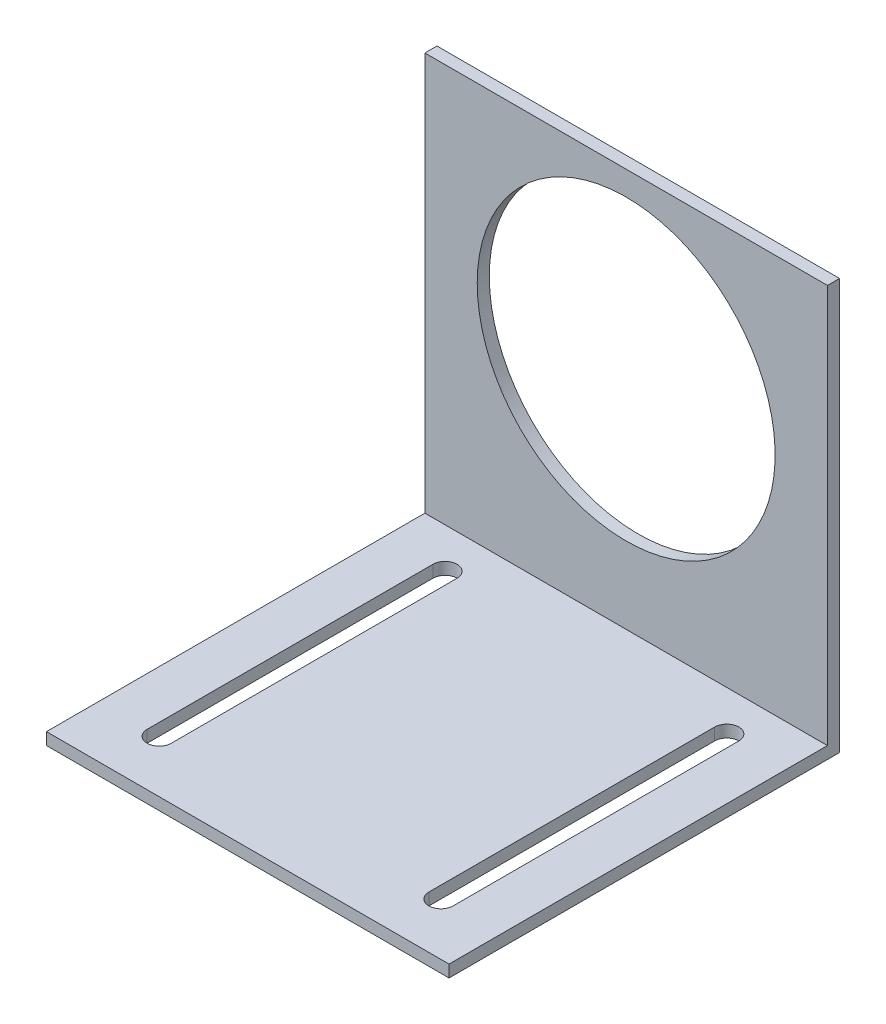
ISO-10303-21;
HEADER;
FILE_DESCRIPTION(('STEP AP214'),'2;1');
FILE_NAME('part.step','',(''),(''),'','','');
FILE_SCHEMA(('AUTOMOTIVE_DESIGN { 1 0 10303 214 1 1 1 1 }'));
ENDSEC;
DATA;
#1=APPLICATION_CONTEXT('core data for automotive mechanical design processes');
#2=APPLICATION_PROTOCOL_DEFINITION('international standard','automotive_design',2000,#1);
#3=PRODUCT_CONTEXT('',#1,'mechanical');
#4=PRODUCT('Part','Part','',(#3));
#5=PRODUCT_RELATED_PRODUCT_CATEGORY('part','',(#4));
#6=PRODUCT_DEFINITION_FORMATION('','',#4);
#7=PRODUCT_DEFINITION_CONTEXT('part definition',#1,'design');
#8=PRODUCT_DEFINITION('design','',#6,#7);
#9=PRODUCT_DEFINITION_SHAPE('','',#8);
#10=(LENGTH_UNIT() NAMED_UNIT(*) SI_UNIT(.MILLI.,.METRE.));
#11=(NAMED_UNIT(*) PLANE_ANGLE_UNIT() SI_UNIT($,.RADIAN.));
#12=(NAMED_UNIT(*) SI_UNIT($,.STERADIAN.) SOLID_ANGLE_UNIT());
#13=UNCERTAINTY_MEASURE_WITH_UNIT(LENGTH_MEASURE(1.E-05),#10,'distance_accuracy_value','');
#14=(GEOMETRIC_REPRESENTATION_CONTEXT(3) GLOBAL_UNCERTAINTY_ASSIGNED_CONTEXT((#13)) GLOBAL_UNIT_ASSIGNED_CONTEXT((#10,
#11,#12)) REPRESENTATION_CONTEXT('',''));
#15=CARTESIAN_POINT('',(0.,0.,0.));
#16=DIRECTION('',(0.,0.,1.));
#17=DIRECTION('',(1.,0.,0.));
#18=AXIS2_PLACEMENT_3D('',#15,#16,#17);
#19=CARTESIAN_POINT('',(0.,3.,0.));
#20=DIRECTION('',(0.,-1.,0.));
#21=DIRECTION('',(0.,0.,-1.));
#22=AXIS2_PLACEMENT_3D('',#19,#20,#21);
#23=PLANE('',#22);
#24=CARTESIAN_POINT('',(85.,3.,-13.));
#25=DIRECTION('',(0.,1.,0.));
#26=DIRECTION('',(0.,0.,1.));
#27=AXIS2_PLACEMENT_3D('',#24,#25,#26);
#28=CIRCLE('',#27,3.00000000000002);
#29=CARTESIAN_POINT('',(82.,3.,-13.));
#30=VERTEX_POINT('',#29);
#31=CARTESIAN_POINT('',(88.,3.,-13.));
#32=VERTEX_POINT('',#31);
#33=EDGE_CURVE('E165',#30,#32,#28,.T.);
#34=ORIENTED_EDGE('',*,*,#33,.F.);
#35=DIRECTION('',(0.,0.,1.));
#36=VECTOR('',#35,1.);
#37=CARTESIAN_POINT('',(82.,3.,-13.));
#38=LINE('',#37,#36);
#39=CARTESIAN_POINT('',(82.,3.,-84.));
#40=VERTEX_POINT('',#39);
#41=EDGE_CURVE('E173',#40,#30,#38,.T.);
#42=ORIENTED_EDGE('',*,*,#41,.F.);
#43=CARTESIAN_POINT('',(85.,3.,-84.));
#44=DIRECTION('',(0.,1.,0.));
#45=DIRECTION('',(0.,0.,1.));
#46=AXIS2_PLACEMENT_3D('',#43,#44,#45);
#47=CIRCLE('',#46,3.00000000000002);
#48=CARTESIAN_POINT('',(88.,3.,-84.));
#49=VERTEX_POINT('',#48);
#50=EDGE_CURVE('E170',#49,#40,#47,.T.);
#51=ORIENTED_EDGE('',*,*,#50,.F.);
#52=DIRECTION('',(0.,0.,-1.));
#53=VECTOR('',#52,1.);
#54=CARTESIAN_POINT('',(88.,3.,-13.));
#55=LINE('',#54,#53);
#56=EDGE_CURVE('E167',#32,#49,#55,.T.);
#57=ORIENTED_EDGE('',*,*,#56,.F.);
#58=EDGE_LOOP('',(#34,#42,#51,#57));
#59=FACE_BOUND('',#58,.T.);
#60=CARTESIAN_POINT('',(15.,3.,-84.));
#61=DIRECTION('',(0.,1.,0.));
#62=DIRECTION('',(0.,0.,1.));
#63=AXIS2_PLACEMENT_3D('',#60,#61,#62);
#64=CIRCLE('',#63,3.);
#65=CARTESIAN_POINT('',(18.,3.,-84.));
#66=VERTEX_POINT('',#65);
#67=CARTESIAN_POINT('',(12.,3.,-84.));
#68=VERTEX_POINT('',#67);
#69=EDGE_CURVE('E196',#66,#68,#64,.T.);
#70=ORIENTED_EDGE('',*,*,#69,.F.);
#71=DIRECTION('',(0.,0.,-1.));
#72=VECTOR('',#71,1.);
#73=CARTESIAN_POINT('',(18.,3.,-84.));
#74=LINE('',#73,#72);
#75=CARTESIAN_POINT('',(18.,3.,-13.));
#76=VERTEX_POINT('',#75);
#77=EDGE_CURVE('E204',#76,#66,#74,.T.);
#78=ORIENTED_EDGE('',*,*,#77,.F.);
#79=CARTESIAN_POINT('',(15.,3.,-13.));
#80=DIRECTION('',(0.,1.,0.));
#81=DIRECTION('',(0.,0.,1.));
#82=AXIS2_PLACEMENT_3D('',#79,#80,#81);
#83=CIRCLE('',#82,3.);
#84=CARTESIAN_POINT('',(12.,3.,-13.));
#85=VERTEX_POINT('',#84);
#86=EDGE_CURVE('E201',#85,#76,#83,.T.);
#87=ORIENTED_EDGE('',*,*,#86,.F.);
#88=DIRECTION('',(0.,0.,1.));
#89=VECTOR('',#88,1.);
#90=CARTESIAN_POINT('',(12.,3.,-84.));
#91=LINE('',#90,#89);
#92=EDGE_CURVE('E198',#68,#85,#91,.T.);
#93=ORIENTED_EDGE('',*,*,#92,.F.);
#94=EDGE_LOOP('',(#70,#78,#87,#93));
#95=FACE_BOUND('',#94,.T.);
#96=DIRECTION('',(1.,0.,0.));
#97=VECTOR('',#96,1.);
#98=CARTESIAN_POINT('',(0.,3.,-94.));
#99=LINE('',#98,#97);
#100=CARTESIAN_POINT('',(0.,3.,-94.));
#101=VERTEX_POINT('',#100);
#102=CARTESIAN_POINT('',(100.,3.,-94.));
#103=VERTEX_POINT('',#102);
#104=EDGE_CURVE('E49',#101,#103,#99,.T.);
#105=ORIENTED_EDGE('',*,*,#104,.F.);
#106=DIRECTION('',(0.,0.,1.));
#107=VECTOR('',#106,1.);
#108=CARTESIAN_POINT('',(0.,3.,0.));
#109=LINE('',#108,#107);
#110=CARTESIAN_POINT('',(0.,3.,0.));
#111=VERTEX_POINT('',#110);
#112=EDGE_CURVE('E139',#101,#111,#109,.T.);
#113=ORIENTED_EDGE('',*,*,#112,.T.);
#114=DIRECTION('',(1.,0.,0.));
#115=VECTOR('',#114,1.);
#116=CARTESIAN_POINT('',(0.,3.,0.));
#117=LINE('',#116,#115);
#118=CARTESIAN_POINT('',(100.,3.,0.));
#119=VERTEX_POINT('',#118);
#120=EDGE_CURVE('E228',#111,#119,#117,.T.);
#121=ORIENTED_EDGE('',*,*,#120,.T.);
#122=DIRECTION('',(0.,0.,-1.));
#123=VECTOR('',#122,1.);
#124=CARTESIAN_POINT('',(100.,3.,0.));
#125=LINE('',#124,#123);
#126=EDGE_CURVE('E54',#119,#103,#125,.T.);
#127=ORIENTED_EDGE('',*,*,#126,.T.);
#128=EDGE_LOOP('',(#105,#113,#121,#127));
#129=FACE_BOUND('',#128,.T.);
#130=ADVANCED_FACE('F34',(#59,#95,#129),#23,.F.);
#131=CARTESIAN_POINT('',(0.,0.,0.));
#132=DIRECTION('',(0.,-1.,0.));
#133=DIRECTION('',(0.,0.,-1.));
#134=AXIS2_PLACEMENT_3D('',#131,#132,#133);
#135=PLANE('',#134);
#136=DIRECTION('',(-1.,0.,0.));
#137=VECTOR('',#136,1.);
#138=CARTESIAN_POINT('',(0.,0.,-97.));
#139=LINE('',#138,#137);
#140=CARTESIAN_POINT('',(100.,0.,-97.));
#141=VERTEX_POINT('',#140);
#142=CARTESIAN_POINT('',(0.,0.,-97.));
#143=VERTEX_POINT('',#142);
#144=EDGE_CURVE('E229',#141,#143,#139,.T.);
#145=ORIENTED_EDGE('',*,*,#144,.F.);
#146=DIRECTION('',(0.,0.,-1.));
#147=VECTOR('',#146,1.);
#148=CARTESIAN_POINT('',(100.,0.,0.));
#149=LINE('',#148,#147);
#150=CARTESIAN_POINT('',(100.,0.,0.));
#151=VERTEX_POINT('',#150);
#152=EDGE_CURVE('E236',#151,#141,#149,.T.);
#153=ORIENTED_EDGE('',*,*,#152,.F.);
#154=DIRECTION('',(1.,0.,0.));
#155=VECTOR('',#154,1.);
#156=CARTESIAN_POINT('',(0.,0.,0.));
#157=LINE('',#156,#155);
#158=CARTESIAN_POINT('',(0.,0.,0.));
#159=VERTEX_POINT('',#158);
#160=EDGE_CURVE('E234',#159,#151,#157,.T.);
#161=ORIENTED_EDGE('',*,*,#160,.F.);
#162=DIRECTION('',(0.,0.,1.));
#163=VECTOR('',#162,1.);
#164=CARTESIAN_POINT('',(0.,0.,0.));
#165=LINE('',#164,#163);
#166=EDGE_CURVE('E226',#143,#159,#165,.T.);
#167=ORIENTED_EDGE('',*,*,#166,.F.);
#168=EDGE_LOOP('',(#145,#153,#161,#167));
#169=FACE_BOUND('',#168,.T.);
#170=DIRECTION('',(0.,0.,-1.));
#171=VECTOR('',#170,1.);
#172=CARTESIAN_POINT('',(18.,0.,-84.));
#173=LINE('',#172,#171);
#174=CARTESIAN_POINT('',(18.,0.,-13.));
#175=VERTEX_POINT('',#174);
#176=CARTESIAN_POINT('',(18.,0.,-84.));
#177=VERTEX_POINT('',#176);
#178=EDGE_CURVE('E199',#175,#177,#173,.T.);
#179=ORIENTED_EDGE('',*,*,#178,.T.);
#180=CARTESIAN_POINT('',(15.,0.,-84.));
#181=DIRECTION('',(0.,1.,0.));
#182=DIRECTION('',(0.,0.,1.));
#183=AXIS2_PLACEMENT_3D('',#180,#181,#182);
#184=CIRCLE('',#183,3.);
#185=CARTESIAN_POINT('',(12.,0.,-84.));
#186=VERTEX_POINT('',#185);
#187=EDGE_CURVE('E195',#177,#186,#184,.T.);
#188=ORIENTED_EDGE('',*,*,#187,.T.);
#189=DIRECTION('',(0.,0.,1.));
#190=VECTOR('',#189,1.);
#191=CARTESIAN_POINT('',(12.,0.,-84.));
#192=LINE('',#191,#190);
#193=CARTESIAN_POINT('',(12.,0.,-13.));
#194=VERTEX_POINT('',#193);
#195=EDGE_CURVE('E209',#186,#194,#192,.T.);
#196=ORIENTED_EDGE('',*,*,#195,.T.);
#197=CARTESIAN_POINT('',(15.,0.,-13.));
#198=DIRECTION('',(0.,1.,0.));
#199=DIRECTION('',(0.,0.,1.));
#200=AXIS2_PLACEMENT_3D('',#197,#198,#199);
#201=CIRCLE('',#200,3.);
#202=EDGE_CURVE('E212',#194,#175,#201,.T.);
#203=ORIENTED_EDGE('',*,*,#202,.T.);
#204=EDGE_LOOP('',(#179,#188,#196,#203));
#205=FACE_BOUND('',#204,.T.);
#206=DIRECTION('',(0.,0.,1.));
#207=VECTOR('',#206,1.);
#208=CARTESIAN_POINT('',(82.,0.,-13.));
#209=LINE('',#208,#207);
#210=CARTESIAN_POINT('',(82.,0.,-84.));
#211=VERTEX_POINT('',#210);
#212=CARTESIAN_POINT('',(82.,0.,-13.));
#213=VERTEX_POINT('',#212);
#214=EDGE_CURVE('E168',#211,#213,#209,.T.);
#215=ORIENTED_EDGE('',*,*,#214,.T.);
#216=CARTESIAN_POINT('',(85.,0.,-13.));
#217=DIRECTION('',(0.,1.,0.));
#218=DIRECTION('',(0.,0.,1.));
#219=AXIS2_PLACEMENT_3D('',#216,#217,#218);
#220=CIRCLE('',#219,3.00000000000002);
#221=CARTESIAN_POINT('',(88.,0.,-13.));
#222=VERTEX_POINT('',#221);
#223=EDGE_CURVE('E164',#213,#222,#220,.T.);
#224=ORIENTED_EDGE('',*,*,#223,.T.);
#225=DIRECTION('',(0.,0.,-1.));
#226=VECTOR('',#225,1.);
#227=CARTESIAN_POINT('',(88.,0.,-13.));
#228=LINE('',#227,#226);
#229=CARTESIAN_POINT('',(88.,0.,-84.));
#230=VERTEX_POINT('',#229);
#231=EDGE_CURVE('E178',#222,#230,#228,.T.);
#232=ORIENTED_EDGE('',*,*,#231,.T.);
#233=CARTESIAN_POINT('',(85.,0.,-84.));
#234=DIRECTION('',(0.,1.,0.));
#235=DIRECTION('',(0.,0.,1.));
#236=AXIS2_PLACEMENT_3D('',#233,#234,#235);
#237=CIRCLE('',#236,3.00000000000002);
#238=EDGE_CURVE('E181',#230,#211,#237,.T.);
#239=ORIENTED_EDGE('',*,*,#238,.T.);
#240=EDGE_LOOP('',(#215,#224,#232,#239));
#241=FACE_BOUND('',#240,.T.);
#242=ADVANCED_FACE('F252',(#169,#205,#241),#135,.T.);
#243=CARTESIAN_POINT('',(0.,3.,0.));
#244=DIRECTION('',(1.,0.,0.));
#245=DIRECTION('',(0.,0.,-1.));
#246=AXIS2_PLACEMENT_3D('',#243,#244,#245);
#247=PLANE('',#246);
#248=ORIENTED_EDGE('',*,*,#166,.T.);
#249=DIRECTION('',(0.,-1.,0.));
#250=VECTOR('',#249,1.);
#251=CARTESIAN_POINT('',(0.,3.,0.));
#252=LINE('',#251,#250);
#253=EDGE_CURVE('E11',#111,#159,#252,.T.);
#254=ORIENTED_EDGE('',*,*,#253,.F.);
#255=ORIENTED_EDGE('',*,*,#112,.F.);
#256=DIRECTION('',(0.,1.,0.));
#257=VECTOR('',#256,1.);
#258=CARTESIAN_POINT('',(0.,0.,-94.));
#259=LINE('',#258,#257);
#260=CARTESIAN_POINT('',(0.,102.,-94.));
#261=VERTEX_POINT('',#260);
#262=EDGE_CURVE('E133',#101,#261,#259,.T.);
#263=ORIENTED_EDGE('',*,*,#262,.T.);
#264=DIRECTION('',(0.,0.,-1.));
#265=VECTOR('',#264,1.);
#266=CARTESIAN_POINT('',(0.,102.,-94.));
#267=LINE('',#266,#265);
#268=CARTESIAN_POINT('',(0.,102.,-97.));
#269=VERTEX_POINT('',#268);
#270=EDGE_CURVE('E136',#261,#269,#267,.T.);
#271=ORIENTED_EDGE('',*,*,#270,.T.);
#272=DIRECTION('',(0.,-1.,0.));
#273=VECTOR('',#272,1.);
#274=CARTESIAN_POINT('',(0.,3.,-97.));
#275=LINE('',#274,#273);
#276=EDGE_CURVE('E232',#269,#143,#275,.T.);
#277=ORIENTED_EDGE('',*,*,#276,.T.);
#278=EDGE_LOOP('',(#248,#254,#255,#263,#271,#277));
#279=FACE_BOUND('',#278,.T.);
#280=ADVANCED_FACE('F36',(#279),#247,.F.);
#281=CARTESIAN_POINT('',(0.,3.,0.));
#282=DIRECTION('',(0.,0.,-1.));
#283=DIRECTION('',(-1.,0.,0.));
#284=AXIS2_PLACEMENT_3D('',#281,#282,#283);
#285=PLANE('',#284);
#286=ORIENTED_EDGE('',*,*,#160,.T.);
#287=DIRECTION('',(0.,-1.,0.));
#288=VECTOR('',#287,1.);
#289=CARTESIAN_POINT('',(100.,3.,0.));
#290=LINE('',#289,#288);
#291=EDGE_CURVE('E42',#119,#151,#290,.T.);
#292=ORIENTED_EDGE('',*,*,#291,.F.);
#293=ORIENTED_EDGE('',*,*,#120,.F.);
#294=ORIENTED_EDGE('',*,*,#253,.T.);
#295=EDGE_LOOP('',(#286,#292,#293,#294));
#296=FACE_BOUND('',#295,.T.);
#297=ADVANCED_FACE('F258',(#296),#285,.F.);
#298=CARTESIAN_POINT('',(100.,3.,0.));
#299=DIRECTION('',(-1.,0.,0.));
#300=DIRECTION('',(0.,0.,1.));
#301=AXIS2_PLACEMENT_3D('',#298,#299,#300);
#302=PLANE('',#301);
#303=DIRECTION('',(0.,-1.,0.));
#304=VECTOR('',#303,1.);
#305=CARTESIAN_POINT('',(100.,3.,-97.));
#306=LINE('',#305,#304);
#307=CARTESIAN_POINT('',(100.,102.,-97.));
#308=VERTEX_POINT('',#307);
#309=EDGE_CURVE('E240',#308,#141,#306,.T.);
#310=ORIENTED_EDGE('',*,*,#309,.F.);
#311=DIRECTION('',(0.,0.,-1.));
#312=VECTOR('',#311,1.);
#313=CARTESIAN_POINT('',(100.,102.,-94.));
#314=LINE('',#313,#312);
#315=CARTESIAN_POINT('',(100.,102.,-94.));
#316=VERTEX_POINT('',#315);
#317=EDGE_CURVE('E150',#316,#308,#314,.T.);
#318=ORIENTED_EDGE('',*,*,#317,.F.);
#319=DIRECTION('',(0.,-1.,0.));
#320=VECTOR('',#319,1.);
#321=CARTESIAN_POINT('',(100.,0.,-94.));
#322=LINE('',#321,#320);
#323=EDGE_CURVE('E151',#316,#103,#322,.T.);
#324=ORIENTED_EDGE('',*,*,#323,.T.);
#325=ORIENTED_EDGE('',*,*,#126,.F.);
#326=ORIENTED_EDGE('',*,*,#291,.T.);
#327=ORIENTED_EDGE('',*,*,#152,.T.);
#328=EDGE_LOOP('',(#310,#318,#324,#325,#326,#327));
#329=FACE_BOUND('',#328,.T.);
#330=ADVANCED_FACE('F246',(#329),#302,.F.);
#331=CARTESIAN_POINT('',(0.,3.,-97.));
#332=DIRECTION('',(0.,0.,1.));
#333=DIRECTION('',(1.,0.,0.));
#334=AXIS2_PLACEMENT_3D('',#331,#332,#333);
#335=PLANE('',#334);
#336=ORIENTED_EDGE('',*,*,#144,.T.);
#337=ORIENTED_EDGE('',*,*,#276,.F.);
#338=DIRECTION('',(1.,0.,0.));
#339=VECTOR('',#338,1.);
#340=CARTESIAN_POINT('',(0.,102.,-97.));
#341=LINE('',#340,#339);
#342=EDGE_CURVE('E143',#269,#308,#341,.T.);
#343=ORIENTED_EDGE('',*,*,#342,.T.);
#344=ORIENTED_EDGE('',*,*,#309,.T.);
#345=EDGE_LOOP('',(#336,#337,#343,#344));
#346=FACE_BOUND('',#345,.T.);
#347=CARTESIAN_POINT('',(50.,59.,-97.));
#348=DIRECTION('',(0.,0.,-1.));
#349=DIRECTION('',(-1.,0.,0.));
#350=AXIS2_PLACEMENT_3D('',#347,#348,#349);
#351=CIRCLE('',#350,37.);
#352=CARTESIAN_POINT('',(13.,59.,-97.));
#353=VERTEX_POINT('',#352);
#354=EDGE_CURVE('E424',#353,#353,#351,.T.);
#355=ORIENTED_EDGE('',*,*,#354,.F.);
#356=EDGE_LOOP('',(#355));
#357=FACE_BOUND('',#356,.T.);
#358=ADVANCED_FACE('F256',(#346,#357),#335,.F.);
#359=CARTESIAN_POINT('',(15.,3.,-84.));
#360=DIRECTION('',(0.,-1.,0.));
#361=DIRECTION('',(0.,0.,-1.));
#362=AXIS2_PLACEMENT_3D('',#359,#360,#361);
#363=CYLINDRICAL_SURFACE('',#362,3.);
#364=ORIENTED_EDGE('',*,*,#187,.F.);
#365=DIRECTION('',(0.,-1.,0.));
#366=VECTOR('',#365,1.);
#367=CARTESIAN_POINT('',(18.,3.,-84.));
#368=LINE('',#367,#366);
#369=EDGE_CURVE('E206',#66,#177,#368,.T.);
#370=ORIENTED_EDGE('',*,*,#369,.F.);
#371=ORIENTED_EDGE('',*,*,#69,.T.);
#372=DIRECTION('',(0.,-1.,0.));
#373=VECTOR('',#372,1.);
#374=CARTESIAN_POINT('',(12.,3.,-84.));
#375=LINE('',#374,#373);
#376=EDGE_CURVE('E223',#68,#186,#375,.T.);
#377=ORIENTED_EDGE('',*,*,#376,.T.);
#378=EDGE_LOOP('',(#364,#370,#371,#377));
#379=FACE_BOUND('',#378,.T.);
#380=ADVANCED_FACE('F269',(#379),#363,.F.);
#381=CARTESIAN_POINT('',(12.,3.,-84.));
#382=DIRECTION('',(1.,0.,0.));
#383=DIRECTION('',(0.,0.,-1.));
#384=AXIS2_PLACEMENT_3D('',#381,#382,#383);
#385=PLANE('',#384);
#386=ORIENTED_EDGE('',*,*,#195,.F.);
#387=ORIENTED_EDGE('',*,*,#376,.F.);
#388=ORIENTED_EDGE('',*,*,#92,.T.);
#389=DIRECTION('',(0.,-1.,0.));
#390=VECTOR('',#389,1.);
#391=CARTESIAN_POINT('',(12.,3.,-13.));
#392=LINE('',#391,#390);
#393=EDGE_CURVE('E221',#85,#194,#392,.T.);
#394=ORIENTED_EDGE('',*,*,#393,.T.);
#395=EDGE_LOOP('',(#386,#387,#388,#394));
#396=FACE_BOUND('',#395,.T.);
#397=ADVANCED_FACE('F352',(#396),#385,.T.);
#398=CARTESIAN_POINT('',(15.,3.,-13.));
#399=DIRECTION('',(0.,-1.,0.));
#400=DIRECTION('',(0.,0.,-1.));
#401=AXIS2_PLACEMENT_3D('',#398,#399,#400);
#402=CYLINDRICAL_SURFACE('',#401,3.);
#403=ORIENTED_EDGE('',*,*,#202,.F.);
#404=ORIENTED_EDGE('',*,*,#393,.F.);
#405=ORIENTED_EDGE('',*,*,#86,.T.);
#406=DIRECTION('',(0.,-1.,0.));
#407=VECTOR('',#406,1.);
#408=CARTESIAN_POINT('',(18.,3.,-13.));
#409=LINE('',#408,#407);
#410=EDGE_CURVE('E219',#76,#175,#409,.T.);
#411=ORIENTED_EDGE('',*,*,#410,.T.);
#412=EDGE_LOOP('',(#403,#404,#405,#411));
#413=FACE_BOUND('',#412,.T.);
#414=ADVANCED_FACE('F342',(#413),#402,.F.);
#415=CARTESIAN_POINT('',(18.,3.,-84.));
#416=DIRECTION('',(-1.,0.,0.));
#417=DIRECTION('',(0.,0.,1.));
#418=AXIS2_PLACEMENT_3D('',#415,#416,#417);
#419=PLANE('',#418);
#420=ORIENTED_EDGE('',*,*,#178,.F.);
#421=ORIENTED_EDGE('',*,*,#410,.F.);
#422=ORIENTED_EDGE('',*,*,#77,.T.);
#423=ORIENTED_EDGE('',*,*,#369,.T.);
#424=EDGE_LOOP('',(#420,#421,#422,#423));
#425=FACE_BOUND('',#424,.T.);
#426=ADVANCED_FACE('F332',(#425),#419,.T.);
#427=CARTESIAN_POINT('',(85.,3.,-13.));
#428=DIRECTION('',(0.,-1.,0.));
#429=DIRECTION('',(0.,0.,-1.));
#430=AXIS2_PLACEMENT_3D('',#427,#428,#429);
#431=CYLINDRICAL_SURFACE('',#430,3.00000000000002);
#432=ORIENTED_EDGE('',*,*,#223,.F.);
#433=DIRECTION('',(0.,-1.,0.));
#434=VECTOR('',#433,1.);
#435=CARTESIAN_POINT('',(82.,3.,-13.));
#436=LINE('',#435,#434);
#437=EDGE_CURVE('E175',#30,#213,#436,.T.);
#438=ORIENTED_EDGE('',*,*,#437,.F.);
#439=ORIENTED_EDGE('',*,*,#33,.T.);
#440=DIRECTION('',(0.,-1.,0.));
#441=VECTOR('',#440,1.);
#442=CARTESIAN_POINT('',(88.,3.,-13.));
#443=LINE('',#442,#441);
#444=EDGE_CURVE('E192',#32,#222,#443,.T.);
#445=ORIENTED_EDGE('',*,*,#444,.T.);
#446=EDGE_LOOP('',(#432,#438,#439,#445));
#447=FACE_BOUND('',#446,.T.);
#448=ADVANCED_FACE('F322',(#447),#431,.F.);
#449=CARTESIAN_POINT('',(88.,3.,-13.));
#450=DIRECTION('',(-1.,0.,0.));
#451=DIRECTION('',(0.,0.,1.));
#452=AXIS2_PLACEMENT_3D('',#449,#450,#451);
#453=PLANE('',#452);
#454=ORIENTED_EDGE('',*,*,#231,.F.);
#455=ORIENTED_EDGE('',*,*,#444,.F.);
#456=ORIENTED_EDGE('',*,*,#56,.T.);
#457=DIRECTION('',(0.,-1.,0.));
#458=VECTOR('',#457,1.);
#459=CARTESIAN_POINT('',(88.,3.,-84.));
#460=LINE('',#459,#458);
#461=EDGE_CURVE('E190',#49,#230,#460,.T.);
#462=ORIENTED_EDGE('',*,*,#461,.T.);
#463=EDGE_LOOP('',(#454,#455,#456,#462));
#464=FACE_BOUND('',#463,.T.);
#465=ADVANCED_FACE('F312',(#464),#453,.T.);
#466=CARTESIAN_POINT('',(85.,3.,-84.));
#467=DIRECTION('',(0.,-1.,0.));
#468=DIRECTION('',(0.,0.,-1.));
#469=AXIS2_PLACEMENT_3D('',#466,#467,#468);
#470=CYLINDRICAL_SURFACE('',#469,3.00000000000002);
#471=ORIENTED_EDGE('',*,*,#238,.F.);
#472=ORIENTED_EDGE('',*,*,#461,.F.);
#473=ORIENTED_EDGE('',*,*,#50,.T.);
#474=DIRECTION('',(0.,-1.,0.));
#475=VECTOR('',#474,1.);
#476=CARTESIAN_POINT('',(82.,3.,-84.));
#477=LINE('',#476,#475);
#478=EDGE_CURVE('E188',#40,#211,#477,.T.);
#479=ORIENTED_EDGE('',*,*,#478,.T.);
#480=EDGE_LOOP('',(#471,#472,#473,#479));
#481=FACE_BOUND('',#480,.T.);
#482=ADVANCED_FACE('F301',(#481),#470,.F.);
#483=CARTESIAN_POINT('',(82.,3.,-13.));
#484=DIRECTION('',(1.,0.,0.));
#485=DIRECTION('',(0.,0.,-1.));
#486=AXIS2_PLACEMENT_3D('',#483,#484,#485);
#487=PLANE('',#486);
#488=ORIENTED_EDGE('',*,*,#214,.F.);
#489=ORIENTED_EDGE('',*,*,#478,.F.);
#490=ORIENTED_EDGE('',*,*,#41,.T.);
#491=ORIENTED_EDGE('',*,*,#437,.T.);
#492=EDGE_LOOP('',(#488,#489,#490,#491));
#493=FACE_BOUND('',#492,.T.);
#494=ADVANCED_FACE('F297',(#493),#487,.T.);
#495=CARTESIAN_POINT('',(0.,0.,-94.));
#496=DIRECTION('',(0.,0.,-1.));
#497=DIRECTION('',(-1.,0.,0.));
#498=AXIS2_PLACEMENT_3D('',#495,#496,#497);
#499=PLANE('',#498);
#500=CARTESIAN_POINT('',(50.,59.,-94.));
#501=DIRECTION('',(0.,0.,-1.));
#502=DIRECTION('',(-1.,0.,0.));
#503=AXIS2_PLACEMENT_3D('',#500,#501,#502);
#504=CIRCLE('',#503,37.);
#505=CARTESIAN_POINT('',(13.,59.,-94.));
#506=VERTEX_POINT('',#505);
#507=EDGE_CURVE('E161',#506,#506,#504,.T.);
#508=ORIENTED_EDGE('',*,*,#507,.T.);
#509=EDGE_LOOP('',(#508));
#510=FACE_BOUND('',#509,.T.);
#511=ORIENTED_EDGE('',*,*,#262,.F.);
#512=ORIENTED_EDGE('',*,*,#104,.T.);
#513=ORIENTED_EDGE('',*,*,#323,.F.);
#514=DIRECTION('',(1.,0.,0.));
#515=VECTOR('',#514,1.);
#516=CARTESIAN_POINT('',(0.,102.,-94.));
#517=LINE('',#516,#515);
#518=EDGE_CURVE('E142',#261,#316,#517,.T.);
#519=ORIENTED_EDGE('',*,*,#518,.F.);
#520=EDGE_LOOP('',(#511,#512,#513,#519));
#521=FACE_BOUND('',#520,.T.);
#522=ADVANCED_FACE('F154',(#510,#521),#499,.F.);
#523=CARTESIAN_POINT('',(0.,102.,-94.));
#524=DIRECTION('',(0.,1.,0.));
#525=DIRECTION('',(-1.,0.,0.));
#526=AXIS2_PLACEMENT_3D('',#523,#524,#525);
#527=PLANE('',#526);
#528=ORIENTED_EDGE('',*,*,#342,.F.);
#529=ORIENTED_EDGE('',*,*,#270,.F.);
#530=ORIENTED_EDGE('',*,*,#518,.T.);
#531=ORIENTED_EDGE('',*,*,#317,.T.);
#532=EDGE_LOOP('',(#528,#529,#530,#531));
#533=FACE_BOUND('',#532,.T.);
#534=ADVANCED_FACE('F147',(#533),#527,.T.);
#535=CARTESIAN_POINT('',(50.,59.,-94.));
#536=DIRECTION('',(0.,0.,-1.));
#537=DIRECTION('',(-1.,0.,0.));
#538=AXIS2_PLACEMENT_3D('',#535,#536,#537);
#539=CYLINDRICAL_SURFACE('',#538,37.);
#540=ORIENTED_EDGE('',*,*,#507,.F.);
#541=EDGE_LOOP('',(#540));
#542=FACE_BOUND('',#541,.T.);
#543=ORIENTED_EDGE('',*,*,#354,.T.);
#544=EDGE_LOOP('',(#543));
#545=FACE_BOUND('',#544,.T.);
#546=ADVANCED_FACE('F406',(#542,#545),#539,.F.);
#547=CLOSED_SHELL('',(#130,#242,#280,#297,#330,#358,#380,#397,#414,#426,#448,#465,#482,#494,
#522,#534,#546));
#548=MANIFOLD_SOLID_BREP('B2',#547);
#549=ADVANCED_BREP_SHAPE_REPRESENTATION('',(#18,#548),#14);
#550=SHAPE_DEFINITION_REPRESENTATION(#9,#549);
ENDSEC;
END-ISO-10303-21;
